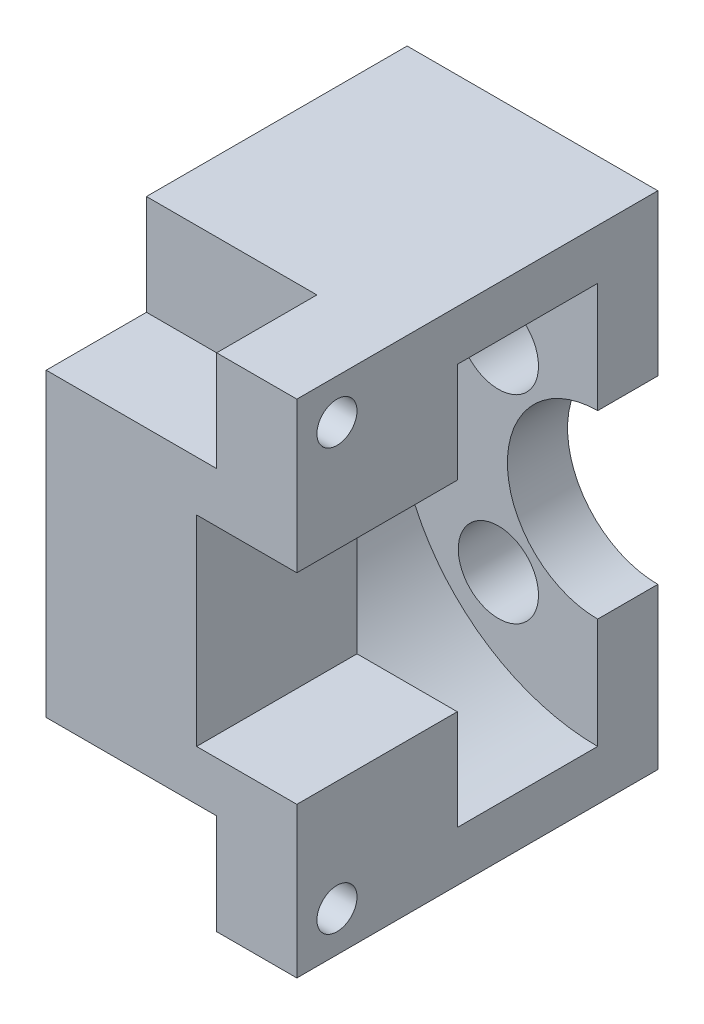
ISO-10303-21;
HEADER;
FILE_DESCRIPTION(('STEP AP214'),'2;1');
FILE_NAME('part.step','',(''),(''),'','','');
FILE_SCHEMA(('AUTOMOTIVE_DESIGN { 1 0 10303 214 1 1 1 1 }'));
ENDSEC;
DATA;
#1=APPLICATION_CONTEXT('core data for automotive mechanical design processes');
#2=APPLICATION_PROTOCOL_DEFINITION('international standard','automotive_design',2000,#1);
#3=PRODUCT_CONTEXT('',#1,'mechanical');
#4=PRODUCT('Part','Part','',(#3));
#5=PRODUCT_RELATED_PRODUCT_CATEGORY('part','',(#4));
#6=PRODUCT_DEFINITION_FORMATION('','',#4);
#7=PRODUCT_DEFINITION_CONTEXT('part definition',#1,'design');
#8=PRODUCT_DEFINITION('design','',#6,#7);
#9=PRODUCT_DEFINITION_SHAPE('','',#8);
#10=(LENGTH_UNIT() NAMED_UNIT(*) SI_UNIT(.MILLI.,.METRE.));
#11=(NAMED_UNIT(*) PLANE_ANGLE_UNIT() SI_UNIT($,.RADIAN.));
#12=(NAMED_UNIT(*) SI_UNIT($,.STERADIAN.) SOLID_ANGLE_UNIT());
#13=UNCERTAINTY_MEASURE_WITH_UNIT(LENGTH_MEASURE(1.E-05),#10,'distance_accuracy_value','');
#14=(GEOMETRIC_REPRESENTATION_CONTEXT(3) GLOBAL_UNCERTAINTY_ASSIGNED_CONTEXT((#13)) GLOBAL_UNIT_ASSIGNED_CONTEXT((#10,
#11,#12)) REPRESENTATION_CONTEXT('',''));
#15=CARTESIAN_POINT('',(0.,0.,0.));
#16=DIRECTION('',(0.,0.,1.));
#17=DIRECTION('',(1.,0.,0.));
#18=AXIS2_PLACEMENT_3D('',#15,#16,#17);
#19=CARTESIAN_POINT('',(-12.5,12.5,10.));
#20=DIRECTION('',(0.,-1.,0.));
#21=DIRECTION('',(0.,0.,-1.));
#22=AXIS2_PLACEMENT_3D('',#19,#20,#21);
#23=PLANE('',#22);
#24=DIRECTION('',(1.,0.,0.));
#25=VECTOR('',#24,1.);
#26=CARTESIAN_POINT('',(-12.5,12.5,13.));
#27=LINE('',#26,#25);
#28=CARTESIAN_POINT('',(-12.5,12.5,13.));
#29=VERTEX_POINT('',#28);
#30=CARTESIAN_POINT('',(-4.,12.5,13.));
#31=VERTEX_POINT('',#30);
#32=EDGE_CURVE('E293',#29,#31,#27,.T.);
#33=ORIENTED_EDGE('',*,*,#32,.T.);
#34=DIRECTION('',(0.,0.,-1.));
#35=VECTOR('',#34,1.);
#36=CARTESIAN_POINT('',(-4.,12.5,18.));
#37=LINE('',#36,#35);
#38=CARTESIAN_POINT('',(-4.,12.5,18.));
#39=VERTEX_POINT('',#38);
#40=EDGE_CURVE('E176',#39,#31,#37,.T.);
#41=ORIENTED_EDGE('',*,*,#40,.F.);
#42=DIRECTION('',(-1.,0.,0.));
#43=VECTOR('',#42,1.);
#44=CARTESIAN_POINT('',(12.5,12.5,18.));
#45=LINE('',#44,#43);
#46=CARTESIAN_POINT('',(0.,12.5,18.));
#47=VERTEX_POINT('',#46);
#48=EDGE_CURVE('E199',#47,#39,#45,.T.);
#49=ORIENTED_EDGE('',*,*,#48,.F.);
#50=DIRECTION('',(0.,0.,-1.));
#51=VECTOR('',#50,1.);
#52=CARTESIAN_POINT('',(0.,12.5,0.));
#53=LINE('',#52,#51);
#54=CARTESIAN_POINT('',(0.,12.5,0.));
#55=VERTEX_POINT('',#54);
#56=EDGE_CURVE('E263',#47,#55,#53,.T.);
#57=ORIENTED_EDGE('',*,*,#56,.T.);
#58=DIRECTION('',(-1.,0.,0.));
#59=VECTOR('',#58,1.);
#60=CARTESIAN_POINT('',(-12.5,12.5,0.));
#61=LINE('',#60,#59);
#62=CARTESIAN_POINT('',(-12.5,12.5,0.));
#63=VERTEX_POINT('',#62);
#64=EDGE_CURVE('E239',#55,#63,#61,.T.);
#65=ORIENTED_EDGE('',*,*,#64,.T.);
#66=DIRECTION('',(0.,0.,-1.));
#67=VECTOR('',#66,1.);
#68=CARTESIAN_POINT('',(-12.5,12.5,10.));
#69=LINE('',#68,#67);
#70=EDGE_CURVE('E49',#29,#63,#69,.T.);
#71=ORIENTED_EDGE('',*,*,#70,.F.);
#72=EDGE_LOOP('',(#33,#41,#49,#57,#65,#71));
#73=FACE_BOUND('',#72,.T.);
#74=ADVANCED_FACE('F41',(#73),#23,.F.);
#75=CARTESIAN_POINT('',(-12.5,-12.5,10.));
#76=DIRECTION('',(1.,0.,0.));
#77=DIRECTION('',(0.,0.,-1.));
#78=AXIS2_PLACEMENT_3D('',#75,#76,#77);
#79=PLANE('',#78);
#80=DIRECTION('',(0.,-1.,0.));
#81=VECTOR('',#80,1.);
#82=CARTESIAN_POINT('',(-12.5,12.5,13.));
#83=LINE('',#82,#81);
#84=CARTESIAN_POINT('',(-12.5,7.5,13.));
#85=VERTEX_POINT('',#84);
#86=EDGE_CURVE('E175',#29,#85,#83,.T.);
#87=ORIENTED_EDGE('',*,*,#86,.F.);
#88=ORIENTED_EDGE('',*,*,#70,.T.);
#89=DIRECTION('',(0.,-1.,0.));
#90=VECTOR('',#89,1.);
#91=CARTESIAN_POINT('',(-12.5,-12.5,0.));
#92=LINE('',#91,#90);
#93=CARTESIAN_POINT('',(-12.5,-12.5,0.));
#94=VERTEX_POINT('',#93);
#95=EDGE_CURVE('E243',#63,#94,#92,.T.);
#96=ORIENTED_EDGE('',*,*,#95,.T.);
#97=DIRECTION('',(0.,0.,-1.));
#98=VECTOR('',#97,1.);
#99=CARTESIAN_POINT('',(-12.5,-12.5,10.));
#100=LINE('',#99,#98);
#101=CARTESIAN_POINT('',(-12.5,-12.5,13.));
#102=VERTEX_POINT('',#101);
#103=EDGE_CURVE('E251',#102,#94,#100,.T.);
#104=ORIENTED_EDGE('',*,*,#103,.F.);
#105=DIRECTION('',(0.,1.,0.));
#106=VECTOR('',#105,1.);
#107=CARTESIAN_POINT('',(-12.5,-12.5,13.));
#108=LINE('',#107,#106);
#109=CARTESIAN_POINT('',(-12.5,-7.5,13.));
#110=VERTEX_POINT('',#109);
#111=EDGE_CURVE('E277',#102,#110,#108,.T.);
#112=ORIENTED_EDGE('',*,*,#111,.T.);
#113=DIRECTION('',(0.,0.,1.));
#114=VECTOR('',#113,1.);
#115=CARTESIAN_POINT('',(-12.5,-7.5,18.));
#116=LINE('',#115,#114);
#117=CARTESIAN_POINT('',(-12.5,-7.5,18.));
#118=VERTEX_POINT('',#117);
#119=EDGE_CURVE('E192',#110,#118,#116,.T.);
#120=ORIENTED_EDGE('',*,*,#119,.T.);
#121=DIRECTION('',(0.,-1.,0.));
#122=VECTOR('',#121,1.);
#123=CARTESIAN_POINT('',(-12.5,12.5,18.));
#124=LINE('',#123,#122);
#125=CARTESIAN_POINT('',(-12.5,7.5,18.));
#126=VERTEX_POINT('',#125);
#127=EDGE_CURVE('E182',#126,#118,#124,.T.);
#128=ORIENTED_EDGE('',*,*,#127,.F.);
#129=DIRECTION('',(0.,0.,1.));
#130=VECTOR('',#129,1.);
#131=CARTESIAN_POINT('',(-12.5,7.5,18.));
#132=LINE('',#131,#130);
#133=EDGE_CURVE('E167',#85,#126,#132,.T.);
#134=ORIENTED_EDGE('',*,*,#133,.F.);
#135=EDGE_LOOP('',(#87,#88,#96,#104,#112,#120,#128,#134));
#136=FACE_BOUND('',#135,.T.);
#137=ADVANCED_FACE('F189',(#136),#79,.F.);
#138=CARTESIAN_POINT('',(0.,0.,18.));
#139=DIRECTION('',(0.,0.,1.));
#140=DIRECTION('',(1.,0.,0.));
#141=AXIS2_PLACEMENT_3D('',#138,#139,#140);
#142=PLANE('',#141);
#143=DIRECTION('',(0.,1.,0.));
#144=VECTOR('',#143,1.);
#145=CARTESIAN_POINT('',(-4.,12.5,18.));
#146=LINE('',#145,#144);
#147=CARTESIAN_POINT('',(-4.,7.5,18.));
#148=VERTEX_POINT('',#147);
#149=EDGE_CURVE('E185',#148,#39,#146,.T.);
#150=ORIENTED_EDGE('',*,*,#149,.F.);
#151=DIRECTION('',(1.,0.,0.));
#152=VECTOR('',#151,1.);
#153=CARTESIAN_POINT('',(-12.5,7.5,18.));
#154=LINE('',#153,#152);
#155=EDGE_CURVE('E56',#126,#148,#154,.T.);
#156=ORIENTED_EDGE('',*,*,#155,.F.);
#157=ORIENTED_EDGE('',*,*,#127,.T.);
#158=DIRECTION('',(1.,0.,0.));
#159=VECTOR('',#158,1.);
#160=CARTESIAN_POINT('',(-12.5,-7.5,18.));
#161=LINE('',#160,#159);
#162=CARTESIAN_POINT('',(-4.,-7.5,18.));
#163=VERTEX_POINT('',#162);
#164=EDGE_CURVE('E299',#118,#163,#161,.T.);
#165=ORIENTED_EDGE('',*,*,#164,.T.);
#166=DIRECTION('',(0.,-1.,0.));
#167=VECTOR('',#166,1.);
#168=CARTESIAN_POINT('',(-4.,-12.5,18.));
#169=LINE('',#168,#167);
#170=CARTESIAN_POINT('',(-4.,-12.5,18.));
#171=VERTEX_POINT('',#170);
#172=EDGE_CURVE('E290',#163,#171,#169,.T.);
#173=ORIENTED_EDGE('',*,*,#172,.T.);
#174=DIRECTION('',(1.,0.,0.));
#175=VECTOR('',#174,1.);
#176=CARTESIAN_POINT('',(-12.5,-12.5,18.));
#177=LINE('',#176,#175);
#178=CARTESIAN_POINT('',(0.,-12.5,18.));
#179=VERTEX_POINT('',#178);
#180=EDGE_CURVE('E194',#171,#179,#177,.T.);
#181=ORIENTED_EDGE('',*,*,#180,.T.);
#182=DIRECTION('',(0.,-1.,0.));
#183=VECTOR('',#182,1.);
#184=CARTESIAN_POINT('',(0.,0.,18.));
#185=LINE('',#184,#183);
#186=CARTESIAN_POINT('',(0.,-5.,18.));
#187=VERTEX_POINT('',#186);
#188=EDGE_CURVE('E318',#187,#179,#185,.T.);
#189=ORIENTED_EDGE('',*,*,#188,.F.);
#190=DIRECTION('',(1.,0.,0.));
#191=VECTOR('',#190,1.);
#192=CARTESIAN_POINT('',(-5.,-5.,18.));
#193=LINE('',#192,#191);
#194=CARTESIAN_POINT('',(-5.,-5.,18.));
#195=VERTEX_POINT('',#194);
#196=EDGE_CURVE('E353',#195,#187,#193,.T.);
#197=ORIENTED_EDGE('',*,*,#196,.F.);
#198=DIRECTION('',(0.,-1.,0.));
#199=VECTOR('',#198,1.);
#200=CARTESIAN_POINT('',(-5.,-5.,18.));
#201=LINE('',#200,#199);
#202=CARTESIAN_POINT('',(-5.,5.,18.));
#203=VERTEX_POINT('',#202);
#204=EDGE_CURVE('E363',#203,#195,#201,.T.);
#205=ORIENTED_EDGE('',*,*,#204,.F.);
#206=DIRECTION('',(-1.,0.,0.));
#207=VECTOR('',#206,1.);
#208=CARTESIAN_POINT('',(-5.,5.,18.));
#209=LINE('',#208,#207);
#210=CARTESIAN_POINT('',(0.,5.,18.));
#211=VERTEX_POINT('',#210);
#212=EDGE_CURVE('E348',#211,#203,#209,.T.);
#213=ORIENTED_EDGE('',*,*,#212,.F.);
#214=EDGE_CURVE('E314',#47,#211,#185,.T.);
#215=ORIENTED_EDGE('',*,*,#214,.F.);
#216=ORIENTED_EDGE('',*,*,#48,.T.);
#217=EDGE_LOOP('',(#150,#156,#157,#165,#173,#181,#189,#197,#205,#213,#215,#216));
#218=FACE_BOUND('',#217,.T.);
#219=ADVANCED_FACE('F180',(#218),#142,.T.);
#220=CARTESIAN_POINT('',(-12.5,-12.5,10.));
#221=DIRECTION('',(0.,1.,0.));
#222=DIRECTION('',(0.,0.,1.));
#223=AXIS2_PLACEMENT_3D('',#220,#221,#222);
#224=PLANE('',#223);
#225=DIRECTION('',(0.,0.,-1.));
#226=VECTOR('',#225,1.);
#227=CARTESIAN_POINT('',(-4.,-12.5,18.));
#228=LINE('',#227,#226);
#229=CARTESIAN_POINT('',(-4.,-12.5,13.));
#230=VERTEX_POINT('',#229);
#231=EDGE_CURVE('E64',#171,#230,#228,.T.);
#232=ORIENTED_EDGE('',*,*,#231,.T.);
#233=DIRECTION('',(1.,0.,0.));
#234=VECTOR('',#233,1.);
#235=CARTESIAN_POINT('',(-12.5,-12.5,13.));
#236=LINE('',#235,#234);
#237=EDGE_CURVE('E276',#102,#230,#236,.T.);
#238=ORIENTED_EDGE('',*,*,#237,.F.);
#239=ORIENTED_EDGE('',*,*,#103,.T.);
#240=DIRECTION('',(1.,0.,0.));
#241=VECTOR('',#240,1.);
#242=CARTESIAN_POINT('',(-12.5,-12.5,0.));
#243=LINE('',#242,#241);
#244=CARTESIAN_POINT('',(0.,-12.5,0.));
#245=VERTEX_POINT('',#244);
#246=EDGE_CURVE('E247',#94,#245,#243,.T.);
#247=ORIENTED_EDGE('',*,*,#246,.T.);
#248=DIRECTION('',(0.,0.,-1.));
#249=VECTOR('',#248,1.);
#250=CARTESIAN_POINT('',(0.,-12.5,0.));
#251=LINE('',#250,#249);
#252=EDGE_CURVE('E274',#179,#245,#251,.T.);
#253=ORIENTED_EDGE('',*,*,#252,.F.);
#254=ORIENTED_EDGE('',*,*,#180,.F.);
#255=EDGE_LOOP('',(#232,#238,#239,#247,#253,#254));
#256=FACE_BOUND('',#255,.T.);
#257=ADVANCED_FACE('F272',(#256),#224,.F.);
#258=CARTESIAN_POINT('',(0.,0.,0.));
#259=DIRECTION('',(0.,0.,-1.));
#260=DIRECTION('',(-1.,0.,0.));
#261=AXIS2_PLACEMENT_3D('',#258,#259,#260);
#262=PLANE('',#261);
#263=DIRECTION('',(0.,-1.,0.));
#264=VECTOR('',#263,1.);
#265=CARTESIAN_POINT('',(0.,12.5,0.));
#266=LINE('',#265,#264);
#267=CARTESIAN_POINT('',(0.,-4.5,0.));
#268=VERTEX_POINT('',#267);
#269=EDGE_CURVE('E269',#268,#245,#266,.T.);
#270=ORIENTED_EDGE('',*,*,#269,.T.);
#271=ORIENTED_EDGE('',*,*,#246,.F.);
#272=ORIENTED_EDGE('',*,*,#95,.F.);
#273=ORIENTED_EDGE('',*,*,#64,.F.);
#274=CARTESIAN_POINT('',(0.,4.5,0.));
#275=VERTEX_POINT('',#274);
#276=EDGE_CURVE('E311',#55,#275,#266,.T.);
#277=ORIENTED_EDGE('',*,*,#276,.T.);
#278=CARTESIAN_POINT('',(0.,0.,0.));
#279=DIRECTION('',(0.,0.,1.));
#280=DIRECTION('',(1.,0.,0.));
#281=AXIS2_PLACEMENT_3D('',#278,#279,#280);
#282=CIRCLE('',#281,4.5);
#283=EDGE_CURVE('E225',#275,#268,#282,.T.);
#284=ORIENTED_EDGE('',*,*,#283,.T.);
#285=EDGE_LOOP('',(#270,#271,#272,#273,#277,#284));
#286=FACE_BOUND('',#285,.T.);
#287=CARTESIAN_POINT('',(-4.94974746830588,-4.94974746830578,0.));
#288=DIRECTION('',(0.,0.,1.));
#289=DIRECTION('',(0.,1.,0.));
#290=AXIS2_PLACEMENT_3D('',#287,#288,#289);
#291=CIRCLE('',#290,2.);
#292=CARTESIAN_POINT('',(-4.94974746830586,-2.94974746830578,0.));
#293=VERTEX_POINT('',#292);
#294=EDGE_CURVE('E208',#293,#293,#291,.T.);
#295=ORIENTED_EDGE('',*,*,#294,.T.);
#296=EDGE_LOOP('',(#295));
#297=FACE_BOUND('',#296,.T.);
#298=CARTESIAN_POINT('',(-4.94974746830583,4.94974746830583,0.));
#299=DIRECTION('',(0.,0.,1.));
#300=DIRECTION('',(1.,0.,0.));
#301=AXIS2_PLACEMENT_3D('',#298,#299,#300);
#302=CIRCLE('',#301,2.);
#303=CARTESIAN_POINT('',(-2.94974746830583,4.94974746830583,0.));
#304=VERTEX_POINT('',#303);
#305=EDGE_CURVE('E217',#304,#304,#302,.T.);
#306=ORIENTED_EDGE('',*,*,#305,.T.);
#307=EDGE_LOOP('',(#306));
#308=FACE_BOUND('',#307,.T.);
#309=ADVANCED_FACE('F267',(#286,#297,#308),#262,.T.);
#310=CARTESIAN_POINT('',(0.,0.,3.));
#311=DIRECTION('',(0.,0.,-1.));
#312=DIRECTION('',(-1.,0.,0.));
#313=AXIS2_PLACEMENT_3D('',#310,#311,#312);
#314=PLANE('',#313);
#315=CARTESIAN_POINT('',(-4.94974746830588,-4.94974746830578,3.));
#316=DIRECTION('',(0.,0.,1.));
#317=DIRECTION('',(0.,1.,0.));
#318=AXIS2_PLACEMENT_3D('',#315,#316,#317);
#319=CIRCLE('',#318,2.);
#320=CARTESIAN_POINT('',(-4.94974746830586,-2.94974746830578,3.));
#321=VERTEX_POINT('',#320);
#322=EDGE_CURVE('E213',#321,#321,#319,.T.);
#323=ORIENTED_EDGE('',*,*,#322,.F.);
#324=EDGE_LOOP('',(#323));
#325=FACE_BOUND('',#324,.T.);
#326=CARTESIAN_POINT('',(-4.94974746830583,4.94974746830583,3.));
#327=DIRECTION('',(0.,0.,1.));
#328=DIRECTION('',(1.,0.,0.));
#329=AXIS2_PLACEMENT_3D('',#326,#327,#328);
#330=CIRCLE('',#329,2.);
#331=CARTESIAN_POINT('',(-2.94974746830583,4.94974746830583,3.));
#332=VERTEX_POINT('',#331);
#333=EDGE_CURVE('E212',#332,#332,#330,.T.);
#334=ORIENTED_EDGE('',*,*,#333,.F.);
#335=EDGE_LOOP('',(#334));
#336=FACE_BOUND('',#335,.T.);
#337=CARTESIAN_POINT('',(0.,0.,3.));
#338=DIRECTION('',(0.,0.,-1.));
#339=DIRECTION('',(-1.,0.,0.));
#340=AXIS2_PLACEMENT_3D('',#337,#338,#339);
#341=CIRCLE('',#340,10.);
#342=CARTESIAN_POINT('',(0.,10.,3.));
#343=VERTEX_POINT('',#342);
#344=CARTESIAN_POINT('',(0.,-10.,3.));
#345=VERTEX_POINT('',#344);
#346=EDGE_CURVE('E229',#343,#345,#341,.F.);
#347=ORIENTED_EDGE('',*,*,#346,.T.);
#348=DIRECTION('',(0.,1.,0.));
#349=VECTOR('',#348,1.);
#350=CARTESIAN_POINT('',(0.,0.,3.));
#351=LINE('',#350,#349);
#352=CARTESIAN_POINT('',(0.,-4.5,3.));
#353=VERTEX_POINT('',#352);
#354=EDGE_CURVE('E332',#345,#353,#351,.T.);
#355=ORIENTED_EDGE('',*,*,#354,.T.);
#356=CARTESIAN_POINT('',(0.,0.,3.));
#357=DIRECTION('',(0.,0.,1.));
#358=DIRECTION('',(1.,0.,0.));
#359=AXIS2_PLACEMENT_3D('',#356,#357,#358);
#360=CIRCLE('',#359,4.5);
#361=CARTESIAN_POINT('',(0.,4.5,3.));
#362=VERTEX_POINT('',#361);
#363=EDGE_CURVE('E221',#362,#353,#360,.T.);
#364=ORIENTED_EDGE('',*,*,#363,.F.);
#365=EDGE_CURVE('E327',#362,#343,#351,.T.);
#366=ORIENTED_EDGE('',*,*,#365,.T.);
#367=EDGE_LOOP('',(#347,#355,#364,#366));
#368=FACE_BOUND('',#367,.T.);
#369=ADVANCED_FACE('F391',(#325,#336,#368),#314,.F.);
#370=CARTESIAN_POINT('',(0.,0.,-28.2842712474619));
#371=DIRECTION('',(0.,0.,1.));
#372=DIRECTION('',(1.,0.,0.));
#373=AXIS2_PLACEMENT_3D('',#370,#371,#372);
#374=CYLINDRICAL_SURFACE('',#373,10.);
#375=CARTESIAN_POINT('',(0.,0.,10.));
#376=DIRECTION('',(0.,0.,1.));
#377=DIRECTION('',(1.,0.,0.));
#378=AXIS2_PLACEMENT_3D('',#375,#376,#377);
#379=CIRCLE('',#378,10.);
#380=CARTESIAN_POINT('',(0.,10.,10.));
#381=VERTEX_POINT('',#380);
#382=CARTESIAN_POINT('',(0.,-10.,10.));
#383=VERTEX_POINT('',#382);
#384=EDGE_CURVE('E207',#381,#383,#379,.T.);
#385=ORIENTED_EDGE('',*,*,#384,.T.);
#386=DIRECTION('',(0.,0.,1.));
#387=VECTOR('',#386,1.);
#388=CARTESIAN_POINT('',(0.,-10.,-28.2842712474619));
#389=LINE('',#388,#387);
#390=EDGE_CURVE('E340',#383,#345,#389,.F.);
#391=ORIENTED_EDGE('',*,*,#390,.T.);
#392=ORIENTED_EDGE('',*,*,#346,.F.);
#393=DIRECTION('',(0.,0.,1.));
#394=VECTOR('',#393,1.);
#395=CARTESIAN_POINT('',(0.,10.,-28.2842712474619));
#396=LINE('',#395,#394);
#397=EDGE_CURVE('E322',#343,#381,#396,.T.);
#398=ORIENTED_EDGE('',*,*,#397,.T.);
#399=EDGE_LOOP('',(#385,#391,#392,#398));
#400=FACE_BOUND('',#399,.T.);
#401=ADVANCED_FACE('F385',(#400),#374,.F.);
#402=CARTESIAN_POINT('',(0.,0.,0.));
#403=DIRECTION('',(0.,0.,1.));
#404=DIRECTION('',(1.,0.,0.));
#405=AXIS2_PLACEMENT_3D('',#402,#403,#404);
#406=CYLINDRICAL_SURFACE('',#405,4.5);
#407=ORIENTED_EDGE('',*,*,#363,.T.);
#408=DIRECTION('',(0.,0.,1.));
#409=VECTOR('',#408,1.);
#410=CARTESIAN_POINT('',(0.,-4.5,0.));
#411=LINE('',#410,#409);
#412=EDGE_CURVE('E344',#353,#268,#411,.F.);
#413=ORIENTED_EDGE('',*,*,#412,.T.);
#414=ORIENTED_EDGE('',*,*,#283,.F.);
#415=DIRECTION('',(0.,0.,1.));
#416=VECTOR('',#415,1.);
#417=CARTESIAN_POINT('',(0.,4.5,0.));
#418=LINE('',#417,#416);
#419=EDGE_CURVE('E331',#275,#362,#418,.T.);
#420=ORIENTED_EDGE('',*,*,#419,.T.);
#421=EDGE_LOOP('',(#407,#413,#414,#420));
#422=FACE_BOUND('',#421,.T.);
#423=ADVANCED_FACE('F394',(#422),#406,.F.);
#424=CARTESIAN_POINT('',(-4.94974746830583,4.94974746830583,0.));
#425=DIRECTION('',(0.,0.,1.));
#426=DIRECTION('',(1.,0.,0.));
#427=AXIS2_PLACEMENT_3D('',#424,#425,#426);
#428=CYLINDRICAL_SURFACE('',#427,2.);
#429=ORIENTED_EDGE('',*,*,#305,.F.);
#430=EDGE_LOOP('',(#429));
#431=FACE_BOUND('',#430,.T.);
#432=ORIENTED_EDGE('',*,*,#333,.T.);
#433=EDGE_LOOP('',(#432));
#434=FACE_BOUND('',#433,.T.);
#435=ADVANCED_FACE('F473',(#431,#434),#428,.F.);
#436=CARTESIAN_POINT('',(-4.94974746830588,-4.94974746830578,0.));
#437=DIRECTION('',(0.,0.,1.));
#438=DIRECTION('',(1.,0.,0.));
#439=AXIS2_PLACEMENT_3D('',#436,#437,#438);
#440=CYLINDRICAL_SURFACE('',#439,2.);
#441=ORIENTED_EDGE('',*,*,#294,.F.);
#442=EDGE_LOOP('',(#441));
#443=FACE_BOUND('',#442,.T.);
#444=ORIENTED_EDGE('',*,*,#322,.T.);
#445=EDGE_LOOP('',(#444));
#446=FACE_BOUND('',#445,.T.);
#447=ADVANCED_FACE('F476',(#443,#446),#440,.F.);
#448=CARTESIAN_POINT('',(0.,0.,10.));
#449=DIRECTION('',(0.,0.,1.));
#450=DIRECTION('',(1.,0.,0.));
#451=AXIS2_PLACEMENT_3D('',#448,#449,#450);
#452=PLANE('',#451);
#453=ORIENTED_EDGE('',*,*,#384,.F.);
#454=DIRECTION('',(0.,-1.,0.));
#455=VECTOR('',#454,1.);
#456=CARTESIAN_POINT('',(0.,0.,10.));
#457=LINE('',#456,#455);
#458=CARTESIAN_POINT('',(0.,5.,10.));
#459=VERTEX_POINT('',#458);
#460=EDGE_CURVE('E317',#381,#459,#457,.T.);
#461=ORIENTED_EDGE('',*,*,#460,.T.);
#462=DIRECTION('',(-1.,0.,0.));
#463=VECTOR('',#462,1.);
#464=CARTESIAN_POINT('',(-5.,5.,10.));
#465=LINE('',#464,#463);
#466=CARTESIAN_POINT('',(-5.,5.,10.));
#467=VERTEX_POINT('',#466);
#468=EDGE_CURVE('E349',#459,#467,#465,.T.);
#469=ORIENTED_EDGE('',*,*,#468,.T.);
#470=DIRECTION('',(0.,-1.,0.));
#471=VECTOR('',#470,1.);
#472=CARTESIAN_POINT('',(-5.,-5.,10.));
#473=LINE('',#472,#471);
#474=CARTESIAN_POINT('',(-5.,-5.,10.));
#475=VERTEX_POINT('',#474);
#476=EDGE_CURVE('E352',#467,#475,#473,.T.);
#477=ORIENTED_EDGE('',*,*,#476,.T.);
#478=DIRECTION('',(1.,0.,0.));
#479=VECTOR('',#478,1.);
#480=CARTESIAN_POINT('',(-5.,-5.,10.));
#481=LINE('',#480,#479);
#482=CARTESIAN_POINT('',(0.,-5.,10.));
#483=VERTEX_POINT('',#482);
#484=EDGE_CURVE('E357',#475,#483,#481,.T.);
#485=ORIENTED_EDGE('',*,*,#484,.T.);
#486=EDGE_CURVE('E323',#483,#383,#457,.T.);
#487=ORIENTED_EDGE('',*,*,#486,.T.);
#488=EDGE_LOOP('',(#453,#461,#469,#477,#485,#487));
#489=FACE_BOUND('',#488,.T.);
#490=ADVANCED_FACE('F383',(#489),#452,.F.);
#491=CARTESIAN_POINT('',(-5.,-5.,10.));
#492=DIRECTION('',(0.,-1.,0.));
#493=DIRECTION('',(0.,0.,-1.));
#494=AXIS2_PLACEMENT_3D('',#491,#492,#493);
#495=PLANE('',#494);
#496=ORIENTED_EDGE('',*,*,#196,.T.);
#497=DIRECTION('',(0.,0.,-1.));
#498=VECTOR('',#497,1.);
#499=CARTESIAN_POINT('',(0.,-5.,10.));
#500=LINE('',#499,#498);
#501=EDGE_CURVE('E336',#187,#483,#500,.T.);
#502=ORIENTED_EDGE('',*,*,#501,.T.);
#503=ORIENTED_EDGE('',*,*,#484,.F.);
#504=DIRECTION('',(0.,0.,1.));
#505=VECTOR('',#504,1.);
#506=CARTESIAN_POINT('',(-5.,-5.,10.));
#507=LINE('',#506,#505);
#508=EDGE_CURVE('E195',#475,#195,#507,.T.);
#509=ORIENTED_EDGE('',*,*,#508,.T.);
#510=EDGE_LOOP('',(#496,#502,#503,#509));
#511=FACE_BOUND('',#510,.T.);
#512=ADVANCED_FACE('F371',(#511),#495,.F.);
#513=CARTESIAN_POINT('',(-5.,-5.,10.));
#514=DIRECTION('',(-1.,0.,0.));
#515=DIRECTION('',(0.,0.,1.));
#516=AXIS2_PLACEMENT_3D('',#513,#514,#515);
#517=PLANE('',#516);
#518=ORIENTED_EDGE('',*,*,#204,.T.);
#519=ORIENTED_EDGE('',*,*,#508,.F.);
#520=ORIENTED_EDGE('',*,*,#476,.F.);
#521=DIRECTION('',(0.,0.,1.));
#522=VECTOR('',#521,1.);
#523=CARTESIAN_POINT('',(-5.,5.,10.));
#524=LINE('',#523,#522);
#525=EDGE_CURVE('E201',#467,#203,#524,.T.);
#526=ORIENTED_EDGE('',*,*,#525,.T.);
#527=EDGE_LOOP('',(#518,#519,#520,#526));
#528=FACE_BOUND('',#527,.T.);
#529=ADVANCED_FACE('F448',(#528),#517,.F.);
#530=CARTESIAN_POINT('',(-5.,5.,10.));
#531=DIRECTION('',(0.,1.,0.));
#532=DIRECTION('',(0.,0.,1.));
#533=AXIS2_PLACEMENT_3D('',#530,#531,#532);
#534=PLANE('',#533);
#535=ORIENTED_EDGE('',*,*,#468,.F.);
#536=DIRECTION('',(0.,0.,1.));
#537=VECTOR('',#536,1.);
#538=CARTESIAN_POINT('',(0.,5.,10.));
#539=LINE('',#538,#537);
#540=EDGE_CURVE('E12',#459,#211,#539,.T.);
#541=ORIENTED_EDGE('',*,*,#540,.T.);
#542=ORIENTED_EDGE('',*,*,#212,.T.);
#543=ORIENTED_EDGE('',*,*,#525,.F.);
#544=EDGE_LOOP('',(#535,#541,#542,#543));
#545=FACE_BOUND('',#544,.T.);
#546=ADVANCED_FACE('F440',(#545),#534,.F.);
#547=CARTESIAN_POINT('',(0.,12.5,0.));
#548=DIRECTION('',(-1.,0.,0.));
#549=DIRECTION('',(0.,0.,1.));
#550=AXIS2_PLACEMENT_3D('',#547,#548,#549);
#551=PLANE('',#550);
#552=CARTESIAN_POINT('',(0.,10.5,16.));
#553=DIRECTION('',(1.,0.,0.));
#554=DIRECTION('',(0.,0.,1.));
#555=AXIS2_PLACEMENT_3D('',#552,#553,#554);
#556=CIRCLE('',#555,1.);
#557=CARTESIAN_POINT('',(0.,10.5,17.));
#558=VERTEX_POINT('',#557);
#559=EDGE_CURVE('E423',#558,#558,#556,.T.);
#560=ORIENTED_EDGE('',*,*,#559,.F.);
#561=EDGE_LOOP('',(#560));
#562=FACE_BOUND('',#561,.T.);
#563=ORIENTED_EDGE('',*,*,#276,.F.);
#564=ORIENTED_EDGE('',*,*,#56,.F.);
#565=ORIENTED_EDGE('',*,*,#214,.T.);
#566=ORIENTED_EDGE('',*,*,#540,.F.);
#567=ORIENTED_EDGE('',*,*,#460,.F.);
#568=ORIENTED_EDGE('',*,*,#397,.F.);
#569=ORIENTED_EDGE('',*,*,#365,.F.);
#570=ORIENTED_EDGE('',*,*,#419,.F.);
#571=EDGE_LOOP('',(#563,#564,#565,#566,#567,#568,#569,#570));
#572=FACE_BOUND('',#571,.T.);
#573=ADVANCED_FACE('F388',(#562,#572),#551,.F.);
#574=CARTESIAN_POINT('',(0.,-10.5,16.));
#575=DIRECTION('',(-1.,0.,0.));
#576=DIRECTION('',(0.,0.,1.));
#577=AXIS2_PLACEMENT_3D('',#574,#575,#576);
#578=CIRCLE('',#577,1.);
#579=CARTESIAN_POINT('',(0.,-10.5,17.));
#580=VERTEX_POINT('',#579);
#581=EDGE_CURVE('E414',#580,#580,#578,.T.);
#582=ORIENTED_EDGE('',*,*,#581,.T.);
#583=EDGE_LOOP('',(#582));
#584=FACE_BOUND('',#583,.T.);
#585=ORIENTED_EDGE('',*,*,#354,.F.);
#586=ORIENTED_EDGE('',*,*,#390,.F.);
#587=ORIENTED_EDGE('',*,*,#486,.F.);
#588=ORIENTED_EDGE('',*,*,#501,.F.);
#589=ORIENTED_EDGE('',*,*,#188,.T.);
#590=ORIENTED_EDGE('',*,*,#252,.T.);
#591=ORIENTED_EDGE('',*,*,#269,.F.);
#592=ORIENTED_EDGE('',*,*,#412,.F.);
#593=EDGE_LOOP('',(#585,#586,#587,#588,#589,#590,#591,#592));
#594=FACE_BOUND('',#593,.T.);
#595=ADVANCED_FACE('F439',(#584,#594),#551,.F.);
#596=CARTESIAN_POINT('',(-12.5,-7.5,18.));
#597=DIRECTION('',(0.,1.,0.));
#598=DIRECTION('',(0.,0.,1.));
#599=AXIS2_PLACEMENT_3D('',#596,#597,#598);
#600=PLANE('',#599);
#601=DIRECTION('',(0.,0.,1.));
#602=VECTOR('',#601,1.);
#603=CARTESIAN_POINT('',(-4.,-7.5,18.));
#604=LINE('',#603,#602);
#605=CARTESIAN_POINT('',(-4.,-7.5,13.));
#606=VERTEX_POINT('',#605);
#607=EDGE_CURVE('E280',#606,#163,#604,.T.);
#608=ORIENTED_EDGE('',*,*,#607,.T.);
#609=ORIENTED_EDGE('',*,*,#164,.F.);
#610=ORIENTED_EDGE('',*,*,#119,.F.);
#611=DIRECTION('',(1.,0.,0.));
#612=VECTOR('',#611,1.);
#613=CARTESIAN_POINT('',(-12.5,-7.5,13.));
#614=LINE('',#613,#612);
#615=EDGE_CURVE('E302',#110,#606,#614,.T.);
#616=ORIENTED_EDGE('',*,*,#615,.T.);
#617=EDGE_LOOP('',(#608,#609,#610,#616));
#618=FACE_BOUND('',#617,.T.);
#619=ADVANCED_FACE('F446',(#618),#600,.F.);
#620=CARTESIAN_POINT('',(-12.5,-12.5,13.));
#621=DIRECTION('',(0.,0.,-1.));
#622=DIRECTION('',(-1.,0.,0.));
#623=AXIS2_PLACEMENT_3D('',#620,#621,#622);
#624=PLANE('',#623);
#625=DIRECTION('',(0.,1.,0.));
#626=VECTOR('',#625,1.);
#627=CARTESIAN_POINT('',(-4.,-12.5,13.));
#628=LINE('',#627,#626);
#629=EDGE_CURVE('E286',#230,#606,#628,.T.);
#630=ORIENTED_EDGE('',*,*,#629,.T.);
#631=ORIENTED_EDGE('',*,*,#615,.F.);
#632=ORIENTED_EDGE('',*,*,#111,.F.);
#633=ORIENTED_EDGE('',*,*,#237,.T.);
#634=EDGE_LOOP('',(#630,#631,#632,#633));
#635=FACE_BOUND('',#634,.T.);
#636=ADVANCED_FACE('F519',(#635),#624,.F.);
#637=CARTESIAN_POINT('',(-4.,0.,0.));
#638=DIRECTION('',(-1.,0.,0.));
#639=DIRECTION('',(0.,0.,1.));
#640=AXIS2_PLACEMENT_3D('',#637,#638,#639);
#641=PLANE('',#640);
#642=CARTESIAN_POINT('',(-4.,-10.5,16.));
#643=DIRECTION('',(-1.,0.,0.));
#644=DIRECTION('',(0.,0.,1.));
#645=AXIS2_PLACEMENT_3D('',#642,#643,#644);
#646=CIRCLE('',#645,1.);
#647=CARTESIAN_POINT('',(-4.,-10.5,17.));
#648=VERTEX_POINT('',#647);
#649=EDGE_CURVE('E419',#648,#648,#646,.T.);
#650=ORIENTED_EDGE('',*,*,#649,.F.);
#651=EDGE_LOOP('',(#650));
#652=FACE_BOUND('',#651,.T.);
#653=ORIENTED_EDGE('',*,*,#172,.F.);
#654=ORIENTED_EDGE('',*,*,#607,.F.);
#655=ORIENTED_EDGE('',*,*,#629,.F.);
#656=ORIENTED_EDGE('',*,*,#231,.F.);
#657=EDGE_LOOP('',(#653,#654,#655,#656));
#658=FACE_BOUND('',#657,.T.);
#659=ADVANCED_FACE('F529',(#652,#658),#641,.T.);
#660=CARTESIAN_POINT('',(-12.5,12.5,13.));
#661=DIRECTION('',(0.,0.,1.));
#662=DIRECTION('',(1.,0.,0.));
#663=AXIS2_PLACEMENT_3D('',#660,#661,#662);
#664=PLANE('',#663);
#665=DIRECTION('',(0.,-1.,0.));
#666=VECTOR('',#665,1.);
#667=CARTESIAN_POINT('',(-4.,12.5,13.));
#668=LINE('',#667,#666);
#669=CARTESIAN_POINT('',(-4.,7.5,13.));
#670=VERTEX_POINT('',#669);
#671=EDGE_CURVE('E401',#31,#670,#668,.T.);
#672=ORIENTED_EDGE('',*,*,#671,.F.);
#673=ORIENTED_EDGE('',*,*,#32,.F.);
#674=ORIENTED_EDGE('',*,*,#86,.T.);
#675=DIRECTION('',(1.,0.,0.));
#676=VECTOR('',#675,1.);
#677=CARTESIAN_POINT('',(-12.5,7.5,13.));
#678=LINE('',#677,#676);
#679=EDGE_CURVE('E170',#85,#670,#678,.T.);
#680=ORIENTED_EDGE('',*,*,#679,.T.);
#681=EDGE_LOOP('',(#672,#673,#674,#680));
#682=FACE_BOUND('',#681,.T.);
#683=ADVANCED_FACE('F411',(#682),#664,.T.);
#684=CARTESIAN_POINT('',(-12.5,7.5,18.));
#685=DIRECTION('',(0.,1.,0.));
#686=DIRECTION('',(0.,0.,1.));
#687=AXIS2_PLACEMENT_3D('',#684,#685,#686);
#688=PLANE('',#687);
#689=DIRECTION('',(0.,0.,1.));
#690=VECTOR('',#689,1.);
#691=CARTESIAN_POINT('',(-4.,7.5,18.));
#692=LINE('',#691,#690);
#693=EDGE_CURVE('E404',#670,#148,#692,.T.);
#694=ORIENTED_EDGE('',*,*,#693,.F.);
#695=ORIENTED_EDGE('',*,*,#679,.F.);
#696=ORIENTED_EDGE('',*,*,#133,.T.);
#697=ORIENTED_EDGE('',*,*,#155,.T.);
#698=EDGE_LOOP('',(#694,#695,#696,#697));
#699=FACE_BOUND('',#698,.T.);
#700=ADVANCED_FACE('F168',(#699),#688,.T.);
#701=CARTESIAN_POINT('',(-4.,0.,0.));
#702=DIRECTION('',(-1.,0.,0.));
#703=DIRECTION('',(0.,0.,1.));
#704=AXIS2_PLACEMENT_3D('',#701,#702,#703);
#705=PLANE('',#704);
#706=CARTESIAN_POINT('',(-4.,10.5,16.));
#707=DIRECTION('',(1.,0.,0.));
#708=DIRECTION('',(0.,0.,1.));
#709=AXIS2_PLACEMENT_3D('',#706,#707,#708);
#710=CIRCLE('',#709,1.);
#711=CARTESIAN_POINT('',(-4.,10.5,17.));
#712=VERTEX_POINT('',#711);
#713=EDGE_CURVE('E427',#712,#712,#710,.T.);
#714=ORIENTED_EDGE('',*,*,#713,.T.);
#715=EDGE_LOOP('',(#714));
#716=FACE_BOUND('',#715,.T.);
#717=ORIENTED_EDGE('',*,*,#149,.T.);
#718=ORIENTED_EDGE('',*,*,#40,.T.);
#719=ORIENTED_EDGE('',*,*,#671,.T.);
#720=ORIENTED_EDGE('',*,*,#693,.T.);
#721=EDGE_LOOP('',(#717,#718,#719,#720));
#722=FACE_BOUND('',#721,.T.);
#723=ADVANCED_FACE('F564',(#716,#722),#705,.T.);
#724=CARTESIAN_POINT('',(0.,-10.5,16.));
#725=DIRECTION('',(-1.,0.,0.));
#726=DIRECTION('',(0.,0.,1.));
#727=AXIS2_PLACEMENT_3D('',#724,#725,#726);
#728=CYLINDRICAL_SURFACE('',#727,1.);
#729=ORIENTED_EDGE('',*,*,#581,.F.);
#730=EDGE_LOOP('',(#729));
#731=FACE_BOUND('',#730,.T.);
#732=ORIENTED_EDGE('',*,*,#649,.T.);
#733=EDGE_LOOP('',(#732));
#734=FACE_BOUND('',#733,.T.);
#735=ADVANCED_FACE('F583',(#731,#734),#728,.F.);
#736=CARTESIAN_POINT('',(0.,10.5,16.));
#737=DIRECTION('',(-1.,0.,0.));
#738=DIRECTION('',(0.,0.,1.));
#739=AXIS2_PLACEMENT_3D('',#736,#737,#738);
#740=CYLINDRICAL_SURFACE('',#739,1.);
#741=ORIENTED_EDGE('',*,*,#559,.T.);
#742=EDGE_LOOP('',(#741));
#743=FACE_BOUND('',#742,.T.);
#744=ORIENTED_EDGE('',*,*,#713,.F.);
#745=EDGE_LOOP('',(#744));
#746=FACE_BOUND('',#745,.T.);
#747=ADVANCED_FACE('F435',(#743,#746),#740,.F.);
#748=CLOSED_SHELL('',(#74,#137,#219,#257,#309,#369,#401,#423,#435,#447,#490,#512,#529,#546,#573,
#595,#619,#636,#659,#683,#700,#723,#735,#747));
#749=MANIFOLD_SOLID_BREP('B2',#748);
#750=ADVANCED_BREP_SHAPE_REPRESENTATION('',(#18,#749),#14);
#751=SHAPE_DEFINITION_REPRESENTATION(#9,#750);
ENDSEC;
END-ISO-10303-21;
